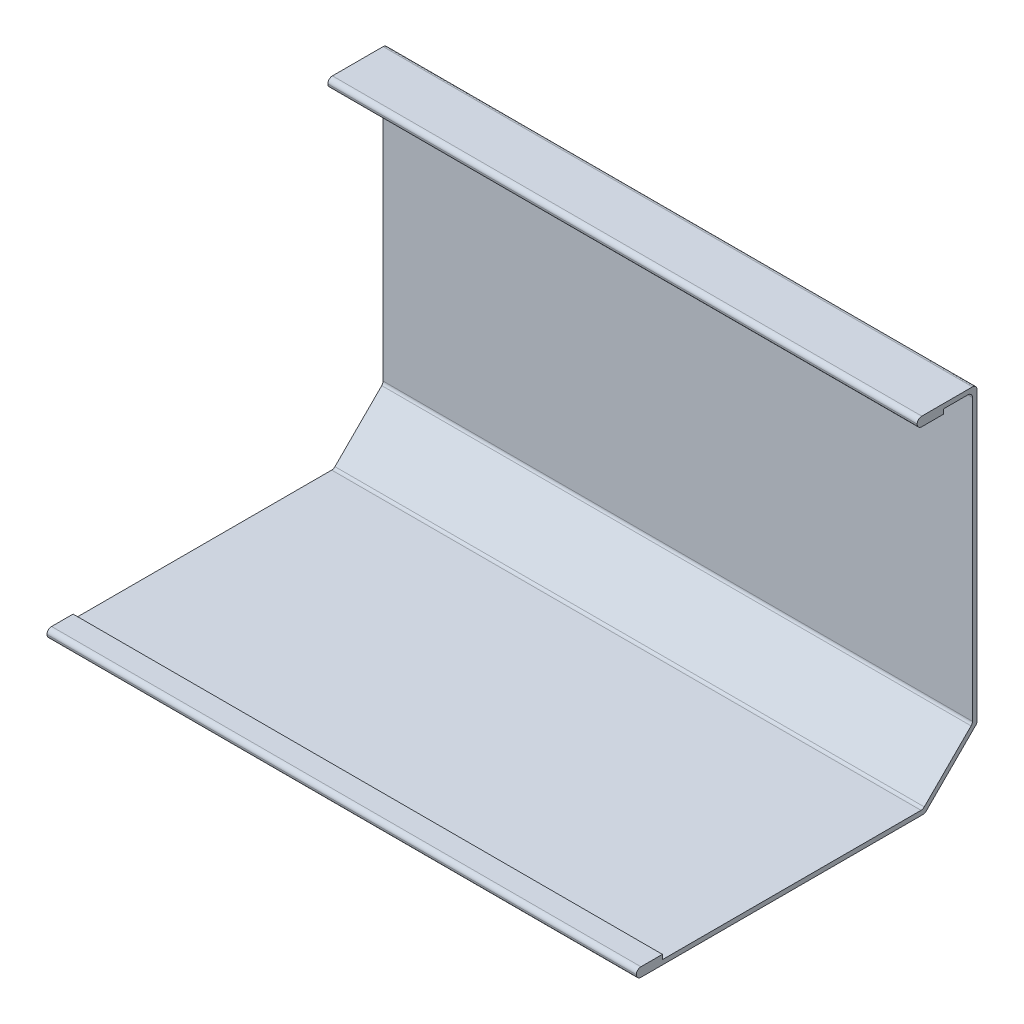
ISO-10303-21;
HEADER;
FILE_DESCRIPTION(('STEP AP214'),'2;1');
FILE_NAME('part.step','',(''),(''),'','','');
FILE_SCHEMA(('AUTOMOTIVE_DESIGN { 1 0 10303 214 1 1 1 1 }'));
ENDSEC;
DATA;
#1=APPLICATION_CONTEXT('core data for automotive mechanical design processes');
#2=APPLICATION_PROTOCOL_DEFINITION('international standard','automotive_design',2000,#1);
#3=PRODUCT_CONTEXT('',#1,'mechanical');
#4=PRODUCT('Part','Part','',(#3));
#5=PRODUCT_RELATED_PRODUCT_CATEGORY('part','',(#4));
#6=PRODUCT_DEFINITION_FORMATION('','',#4);
#7=PRODUCT_DEFINITION_CONTEXT('part definition',#1,'design');
#8=PRODUCT_DEFINITION('design','',#6,#7);
#9=PRODUCT_DEFINITION_SHAPE('','',#8);
#10=(LENGTH_UNIT() NAMED_UNIT(*) SI_UNIT(.MILLI.,.METRE.));
#11=(NAMED_UNIT(*) PLANE_ANGLE_UNIT() SI_UNIT($,.RADIAN.));
#12=(NAMED_UNIT(*) SI_UNIT($,.STERADIAN.) SOLID_ANGLE_UNIT());
#13=UNCERTAINTY_MEASURE_WITH_UNIT(LENGTH_MEASURE(1.E-05),#10,'distance_accuracy_value','');
#14=(GEOMETRIC_REPRESENTATION_CONTEXT(3) GLOBAL_UNCERTAINTY_ASSIGNED_CONTEXT((#13)) GLOBAL_UNIT_ASSIGNED_CONTEXT((#10,
#11,#12)) REPRESENTATION_CONTEXT('',''));
#15=CARTESIAN_POINT('',(0.,0.,0.));
#16=DIRECTION('',(0.,0.,1.));
#17=DIRECTION('',(1.,0.,0.));
#18=AXIS2_PLACEMENT_3D('',#15,#16,#17);
#19=CARTESIAN_POINT('',(-96.,9.56066017177982,9.56066017177978));
#20=DIRECTION('',(0.,0.707106781186549,0.707106781186546));
#21=DIRECTION('',(0.,-0.707106781186546,0.707106781186549));
#22=AXIS2_PLACEMENT_3D('',#19,#20,#21);
#23=PLANE('',#22);
#24=DIRECTION('',(0.,-0.707106781186546,0.707106781186549));
#25=VECTOR('',#24,1.);
#26=CARTESIAN_POINT('',(-96.,9.56066017177982,9.56066017177978));
#27=LINE('',#26,#25);
#28=CARTESIAN_POINT('',(-96.,17.1819805153393,1.93933982822023));
#29=VERTEX_POINT('',#28);
#30=CARTESIAN_POINT('',(-96.,1.93933982822018,17.1819805153395));
#31=VERTEX_POINT('',#30);
#32=EDGE_CURVE('E234',#29,#31,#27,.T.);
#33=ORIENTED_EDGE('',*,*,#32,.T.);
#34=DIRECTION('',(1.,0.,0.));
#35=VECTOR('',#34,1.);
#36=CARTESIAN_POINT('',(96.,1.93933982822018,17.1819805153395));
#37=LINE('',#36,#35);
#38=CARTESIAN_POINT('',(96.,1.93933982822018,17.1819805153395));
#39=VERTEX_POINT('',#38);
#40=EDGE_CURVE('E307',#31,#39,#37,.T.);
#41=ORIENTED_EDGE('',*,*,#40,.T.);
#42=DIRECTION('',(0.,-0.707106781186546,0.707106781186549));
#43=VECTOR('',#42,1.);
#44=CARTESIAN_POINT('',(96.,9.56066017177982,9.56066017177978));
#45=LINE('',#44,#43);
#46=CARTESIAN_POINT('',(96.,17.1819805153393,1.93933982822023));
#47=VERTEX_POINT('',#46);
#48=EDGE_CURVE('E193',#47,#39,#45,.T.);
#49=ORIENTED_EDGE('',*,*,#48,.F.);
#50=DIRECTION('',(1.,0.,0.));
#51=VECTOR('',#50,1.);
#52=CARTESIAN_POINT('',(-96.,17.1819805153393,1.93933982822023));
#53=LINE('',#52,#51);
#54=EDGE_CURVE('E305',#47,#29,#53,.F.);
#55=ORIENTED_EDGE('',*,*,#54,.T.);
#56=EDGE_LOOP('',(#33,#41,#49,#55));
#57=FACE_BOUND('',#56,.T.);
#58=ADVANCED_FACE('F33',(#57),#23,.T.);
#59=CARTESIAN_POINT('',(-96.,0.,1.50000000000007));
#60=DIRECTION('',(0.,0.,-1.));
#61=DIRECTION('',(0.,1.,0.));
#62=AXIS2_PLACEMENT_3D('',#59,#60,#61);
#63=PLANE('',#62);
#64=DIRECTION('',(0.,1.,0.));
#65=VECTOR('',#64,1.);
#66=CARTESIAN_POINT('',(-96.,0.,1.50000000000007));
#67=LINE('',#66,#65);
#68=CARTESIAN_POINT('',(-96.,18.2426406871192,1.50000000000005));
#69=VERTEX_POINT('',#68);
#70=CARTESIAN_POINT('',(-96.,109.6,1.5));
#71=VERTEX_POINT('',#70);
#72=EDGE_CURVE('E203',#69,#71,#67,.T.);
#73=ORIENTED_EDGE('',*,*,#72,.F.);
#74=DIRECTION('',(1.,0.,0.));
#75=VECTOR('',#74,1.);
#76=CARTESIAN_POINT('',(-96.,18.2426406871192,1.50000000000005));
#77=LINE('',#76,#75);
#78=CARTESIAN_POINT('',(96.,18.2426406871192,1.50000000000005));
#79=VERTEX_POINT('',#78);
#80=EDGE_CURVE('E323',#69,#79,#77,.T.);
#81=ORIENTED_EDGE('',*,*,#80,.T.);
#82=DIRECTION('',(0.,1.,0.));
#83=VECTOR('',#82,1.);
#84=CARTESIAN_POINT('',(96.,0.,1.50000000000007));
#85=LINE('',#84,#83);
#86=CARTESIAN_POINT('',(96.,109.6,1.5));
#87=VERTEX_POINT('',#86);
#88=EDGE_CURVE('E231',#79,#87,#85,.T.);
#89=ORIENTED_EDGE('',*,*,#88,.T.);
#90=DIRECTION('',(1.,0.,0.));
#91=VECTOR('',#90,1.);
#92=CARTESIAN_POINT('',(-96.,109.6,1.5));
#93=LINE('',#92,#91);
#94=EDGE_CURVE('E321',#87,#71,#93,.F.);
#95=ORIENTED_EDGE('',*,*,#94,.T.);
#96=EDGE_LOOP('',(#73,#81,#89,#95));
#97=FACE_BOUND('',#96,.T.);
#98=ADVANCED_FACE('F419',(#97),#63,.F.);
#99=CARTESIAN_POINT('',(-96.,111.1,0.));
#100=DIRECTION('',(0.,-1.,0.));
#101=DIRECTION('',(0.,0.,-1.));
#102=AXIS2_PLACEMENT_3D('',#99,#100,#101);
#103=PLANE('',#102);
#104=DIRECTION('',(0.,0.,-1.));
#105=VECTOR('',#104,1.);
#106=CARTESIAN_POINT('',(-96.,111.1,0.));
#107=LINE('',#106,#105);
#108=CARTESIAN_POINT('',(-96.,111.1,11.));
#109=VERTEX_POINT('',#108);
#110=CARTESIAN_POINT('',(-96.,111.1,3.));
#111=VERTEX_POINT('',#110);
#112=EDGE_CURVE('E259',#109,#111,#107,.T.);
#113=ORIENTED_EDGE('',*,*,#112,.T.);
#114=DIRECTION('',(1.,0.,0.));
#115=VECTOR('',#114,1.);
#116=CARTESIAN_POINT('',(-96.,111.1,3.));
#117=LINE('',#116,#115);
#118=CARTESIAN_POINT('',(96.,111.1,3.));
#119=VERTEX_POINT('',#118);
#120=EDGE_CURVE('E326',#111,#119,#117,.T.);
#121=ORIENTED_EDGE('',*,*,#120,.T.);
#122=DIRECTION('',(0.,0.,-1.));
#123=VECTOR('',#122,1.);
#124=CARTESIAN_POINT('',(96.,111.1,0.));
#125=LINE('',#124,#123);
#126=CARTESIAN_POINT('',(96.,111.1,11.));
#127=VERTEX_POINT('',#126);
#128=EDGE_CURVE('E228',#127,#119,#125,.T.);
#129=ORIENTED_EDGE('',*,*,#128,.F.);
#130=DIRECTION('',(1.,0.,0.));
#131=VECTOR('',#130,1.);
#132=CARTESIAN_POINT('',(-96.,111.1,11.));
#133=LINE('',#132,#131);
#134=EDGE_CURVE('E264',#109,#127,#133,.T.);
#135=ORIENTED_EDGE('',*,*,#134,.F.);
#136=EDGE_LOOP('',(#113,#121,#129,#135));
#137=FACE_BOUND('',#136,.T.);
#138=ADVANCED_FACE('F409',(#137),#103,.T.);
#139=CARTESIAN_POINT('',(-96.,0.,11.));
#140=DIRECTION('',(0.,0.,-1.));
#141=DIRECTION('',(-1.,0.,0.));
#142=AXIS2_PLACEMENT_3D('',#139,#140,#141);
#143=PLANE('',#142);
#144=ORIENTED_EDGE('',*,*,#134,.T.);
#145=DIRECTION('',(0.,1.,0.));
#146=VECTOR('',#145,1.);
#147=CARTESIAN_POINT('',(96.,0.,11.));
#148=LINE('',#147,#146);
#149=CARTESIAN_POINT('',(96.,109.6,11.));
#150=VERTEX_POINT('',#149);
#151=EDGE_CURVE('E225',#150,#127,#148,.T.);
#152=ORIENTED_EDGE('',*,*,#151,.F.);
#153=DIRECTION('',(1.,0.,0.));
#154=VECTOR('',#153,1.);
#155=CARTESIAN_POINT('',(-96.,109.6,11.));
#156=LINE('',#155,#154);
#157=CARTESIAN_POINT('',(-96.,109.6,11.));
#158=VERTEX_POINT('',#157);
#159=EDGE_CURVE('E267',#158,#150,#156,.T.);
#160=ORIENTED_EDGE('',*,*,#159,.F.);
#161=DIRECTION('',(0.,1.,0.));
#162=VECTOR('',#161,1.);
#163=CARTESIAN_POINT('',(-96.,0.,11.));
#164=LINE('',#163,#162);
#165=EDGE_CURVE('E256',#158,#109,#164,.T.);
#166=ORIENTED_EDGE('',*,*,#165,.T.);
#167=EDGE_LOOP('',(#144,#152,#160,#166));
#168=FACE_BOUND('',#167,.T.);
#169=ADVANCED_FACE('F406',(#168),#143,.T.);
#170=CARTESIAN_POINT('',(-96.,109.6,0.));
#171=DIRECTION('',(0.,-1.,0.));
#172=DIRECTION('',(0.,0.,-1.));
#173=AXIS2_PLACEMENT_3D('',#170,#171,#172);
#174=PLANE('',#173);
#175=DIRECTION('',(0.,0.,-1.));
#176=VECTOR('',#175,1.);
#177=CARTESIAN_POINT('',(96.,109.6,0.));
#178=LINE('',#177,#176);
#179=CARTESIAN_POINT('',(96.,109.6,18.));
#180=VERTEX_POINT('',#179);
#181=EDGE_CURVE('E223',#180,#150,#178,.T.);
#182=ORIENTED_EDGE('',*,*,#181,.F.);
#183=DIRECTION('',(1.,0.,0.));
#184=VECTOR('',#183,1.);
#185=CARTESIAN_POINT('',(-96.,109.6,18.));
#186=LINE('',#185,#184);
#187=CARTESIAN_POINT('',(-96.,109.6,18.));
#188=VERTEX_POINT('',#187);
#189=EDGE_CURVE('E333',#180,#188,#186,.F.);
#190=ORIENTED_EDGE('',*,*,#189,.T.);
#191=DIRECTION('',(0.,0.,-1.));
#192=VECTOR('',#191,1.);
#193=CARTESIAN_POINT('',(-96.,109.6,0.));
#194=LINE('',#193,#192);
#195=EDGE_CURVE('E254',#188,#158,#194,.T.);
#196=ORIENTED_EDGE('',*,*,#195,.T.);
#197=ORIENTED_EDGE('',*,*,#159,.T.);
#198=EDGE_LOOP('',(#182,#190,#196,#197));
#199=FACE_BOUND('',#198,.T.);
#200=ADVANCED_FACE('F401',(#199),#174,.T.);
#201=CARTESIAN_POINT('',(-96.,112.6,0.));
#202=DIRECTION('',(0.,1.,0.));
#203=DIRECTION('',(0.,0.,1.));
#204=AXIS2_PLACEMENT_3D('',#201,#202,#203);
#205=PLANE('',#204);
#206=DIRECTION('',(0.,0.,1.));
#207=VECTOR('',#206,1.);
#208=CARTESIAN_POINT('',(96.,112.6,0.));
#209=LINE('',#208,#207);
#210=CARTESIAN_POINT('',(96.,112.6,1.5));
#211=VERTEX_POINT('',#210);
#212=CARTESIAN_POINT('',(96.,112.6,18.));
#213=VERTEX_POINT('',#212);
#214=EDGE_CURVE('E220',#211,#213,#209,.T.);
#215=ORIENTED_EDGE('',*,*,#214,.F.);
#216=DIRECTION('',(1.,0.,0.));
#217=VECTOR('',#216,1.);
#218=CARTESIAN_POINT('',(-96.,112.6,1.5));
#219=LINE('',#218,#217);
#220=CARTESIAN_POINT('',(-96.,112.6,1.5));
#221=VERTEX_POINT('',#220);
#222=EDGE_CURVE('E331',#211,#221,#219,.F.);
#223=ORIENTED_EDGE('',*,*,#222,.T.);
#224=DIRECTION('',(0.,0.,1.));
#225=VECTOR('',#224,1.);
#226=CARTESIAN_POINT('',(-96.,112.6,0.));
#227=LINE('',#226,#225);
#228=CARTESIAN_POINT('',(-96.,112.6,18.));
#229=VERTEX_POINT('',#228);
#230=EDGE_CURVE('E251',#221,#229,#227,.T.);
#231=ORIENTED_EDGE('',*,*,#230,.T.);
#232=DIRECTION('',(1.,0.,0.));
#233=VECTOR('',#232,1.);
#234=CARTESIAN_POINT('',(-96.,112.6,18.));
#235=LINE('',#234,#233);
#236=EDGE_CURVE('E329',#229,#213,#235,.T.);
#237=ORIENTED_EDGE('',*,*,#236,.T.);
#238=EDGE_LOOP('',(#215,#223,#231,#237));
#239=FACE_BOUND('',#238,.T.);
#240=ADVANCED_FACE('F365',(#239),#205,.T.);
#241=CARTESIAN_POINT('',(-96.,0.,0.));
#242=DIRECTION('',(0.,0.,-1.));
#243=DIRECTION('',(-1.,0.,0.));
#244=AXIS2_PLACEMENT_3D('',#241,#242,#243);
#245=PLANE('',#244);
#246=DIRECTION('',(0.,1.,0.));
#247=VECTOR('',#246,1.);
#248=CARTESIAN_POINT('',(96.,0.,0.));
#249=LINE('',#248,#247);
#250=CARTESIAN_POINT('',(96.,17.6213203435596,0.));
#251=VERTEX_POINT('',#250);
#252=CARTESIAN_POINT('',(96.,111.1,0.));
#253=VERTEX_POINT('',#252);
#254=EDGE_CURVE('E217',#251,#253,#249,.T.);
#255=ORIENTED_EDGE('',*,*,#254,.F.);
#256=DIRECTION('',(1.,0.,0.));
#257=VECTOR('',#256,1.);
#258=CARTESIAN_POINT('',(-96.,17.6213203435596,0.));
#259=LINE('',#258,#257);
#260=CARTESIAN_POINT('',(-96.,17.6213203435596,0.));
#261=VERTEX_POINT('',#260);
#262=EDGE_CURVE('E319',#251,#261,#259,.F.);
#263=ORIENTED_EDGE('',*,*,#262,.T.);
#264=DIRECTION('',(0.,1.,0.));
#265=VECTOR('',#264,1.);
#266=CARTESIAN_POINT('',(-96.,0.,0.));
#267=LINE('',#266,#265);
#268=CARTESIAN_POINT('',(-96.,111.1,0.));
#269=VERTEX_POINT('',#268);
#270=EDGE_CURVE('E248',#261,#269,#267,.T.);
#271=ORIENTED_EDGE('',*,*,#270,.T.);
#272=DIRECTION('',(1.,0.,0.));
#273=VECTOR('',#272,1.);
#274=CARTESIAN_POINT('',(-96.,111.1,0.));
#275=LINE('',#274,#273);
#276=EDGE_CURVE('E316',#269,#253,#275,.T.);
#277=ORIENTED_EDGE('',*,*,#276,.T.);
#278=EDGE_LOOP('',(#255,#263,#271,#277));
#279=FACE_BOUND('',#278,.T.);
#280=ADVANCED_FACE('F374',(#279),#245,.T.);
#281=CARTESIAN_POINT('',(-96.,8.5,8.5));
#282=DIRECTION('',(0.,-0.707106781186547,-0.707106781186547));
#283=DIRECTION('',(0.,0.707106781186548,-0.707106781186548));
#284=AXIS2_PLACEMENT_3D('',#281,#282,#283);
#285=PLANE('',#284);
#286=DIRECTION('',(0.,0.707106781186548,-0.707106781186548));
#287=VECTOR('',#286,1.);
#288=CARTESIAN_POINT('',(-96.,8.5,8.5));
#289=LINE('',#288,#287);
#290=CARTESIAN_POINT('',(-96.,0.439339828220179,16.5606601717798));
#291=VERTEX_POINT('',#290);
#292=CARTESIAN_POINT('',(-96.,16.5606601717798,0.439339828220179));
#293=VERTEX_POINT('',#292);
#294=EDGE_CURVE('E245',#291,#293,#289,.T.);
#295=ORIENTED_EDGE('',*,*,#294,.T.);
#296=DIRECTION('',(1.,0.,0.));
#297=VECTOR('',#296,1.);
#298=CARTESIAN_POINT('',(-96.,16.5606601717798,0.43933982822018));
#299=LINE('',#298,#297);
#300=CARTESIAN_POINT('',(96.,16.5606601717798,0.439339828220179));
#301=VERTEX_POINT('',#300);
#302=EDGE_CURVE('E313',#293,#301,#299,.T.);
#303=ORIENTED_EDGE('',*,*,#302,.T.);
#304=DIRECTION('',(0.,0.707106781186548,-0.707106781186548));
#305=VECTOR('',#304,1.);
#306=CARTESIAN_POINT('',(96.,8.5,8.5));
#307=LINE('',#306,#305);
#308=CARTESIAN_POINT('',(96.,0.439339828220179,16.5606601717798));
#309=VERTEX_POINT('',#308);
#310=EDGE_CURVE('E214',#309,#301,#307,.T.);
#311=ORIENTED_EDGE('',*,*,#310,.F.);
#312=DIRECTION('',(1.,0.,0.));
#313=VECTOR('',#312,1.);
#314=CARTESIAN_POINT('',(-96.,0.43933982822018,16.5606601717798));
#315=LINE('',#314,#313);
#316=EDGE_CURVE('E311',#309,#291,#315,.F.);
#317=ORIENTED_EDGE('',*,*,#316,.T.);
#318=EDGE_LOOP('',(#295,#303,#311,#317));
#319=FACE_BOUND('',#318,.T.);
#320=ADVANCED_FACE('F382',(#319),#285,.T.);
#321=CARTESIAN_POINT('',(-96.,0.,0.));
#322=DIRECTION('',(0.,-1.,0.));
#323=DIRECTION('',(0.,0.,-1.));
#324=AXIS2_PLACEMENT_3D('',#321,#322,#323);
#325=PLANE('',#324);
#326=DIRECTION('',(0.,0.,-1.));
#327=VECTOR('',#326,1.);
#328=CARTESIAN_POINT('',(96.,0.,0.));
#329=LINE('',#328,#327);
#330=CARTESIAN_POINT('',(96.,0.,109.5));
#331=VERTEX_POINT('',#330);
#332=CARTESIAN_POINT('',(96.,0.,17.6213203435596));
#333=VERTEX_POINT('',#332);
#334=EDGE_CURVE('E208',#331,#333,#329,.T.);
#335=ORIENTED_EDGE('',*,*,#334,.F.);
#336=DIRECTION('',(1.,0.,0.));
#337=VECTOR('',#336,1.);
#338=CARTESIAN_POINT('',(-96.,0.,109.5));
#339=LINE('',#338,#337);
#340=CARTESIAN_POINT('',(-96.,0.,109.5));
#341=VERTEX_POINT('',#340);
#342=EDGE_CURVE('E287',#331,#341,#339,.F.);
#343=ORIENTED_EDGE('',*,*,#342,.T.);
#344=DIRECTION('',(0.,0.,-1.));
#345=VECTOR('',#344,1.);
#346=CARTESIAN_POINT('',(-96.,0.,0.));
#347=LINE('',#346,#345);
#348=CARTESIAN_POINT('',(-96.,0.,17.6213203435596));
#349=VERTEX_POINT('',#348);
#350=EDGE_CURVE('E242',#341,#349,#347,.T.);
#351=ORIENTED_EDGE('',*,*,#350,.T.);
#352=DIRECTION('',(1.,0.,0.));
#353=VECTOR('',#352,1.);
#354=CARTESIAN_POINT('',(-96.,0.,17.6213203435596));
#355=LINE('',#354,#353);
#356=EDGE_CURVE('E284',#349,#333,#355,.T.);
#357=ORIENTED_EDGE('',*,*,#356,.T.);
#358=EDGE_LOOP('',(#335,#343,#351,#357));
#359=FACE_BOUND('',#358,.T.);
#360=ADVANCED_FACE('F390',(#359),#325,.T.);
#361=CARTESIAN_POINT('',(-96.,3.,0.));
#362=DIRECTION('',(0.,1.,0.));
#363=DIRECTION('',(0.,0.,1.));
#364=AXIS2_PLACEMENT_3D('',#361,#362,#363);
#365=PLANE('',#364);
#366=DIRECTION('',(0.,0.,1.));
#367=VECTOR('',#366,1.);
#368=CARTESIAN_POINT('',(-96.,3.,0.));
#369=LINE('',#368,#367);
#370=CARTESIAN_POINT('',(-96.,3.,102.5));
#371=VERTEX_POINT('',#370);
#372=CARTESIAN_POINT('',(-96.,3.,109.5));
#373=VERTEX_POINT('',#372);
#374=EDGE_CURVE('E240',#371,#373,#369,.T.);
#375=ORIENTED_EDGE('',*,*,#374,.T.);
#376=DIRECTION('',(1.,0.,0.));
#377=VECTOR('',#376,1.);
#378=CARTESIAN_POINT('',(-96.,3.,109.5));
#379=LINE('',#378,#377);
#380=CARTESIAN_POINT('',(96.,3.,109.5));
#381=VERTEX_POINT('',#380);
#382=EDGE_CURVE('E303',#373,#381,#379,.T.);
#383=ORIENTED_EDGE('',*,*,#382,.T.);
#384=DIRECTION('',(0.,0.,1.));
#385=VECTOR('',#384,1.);
#386=CARTESIAN_POINT('',(96.,3.,0.));
#387=LINE('',#386,#385);
#388=CARTESIAN_POINT('',(96.,3.,102.5));
#389=VERTEX_POINT('',#388);
#390=EDGE_CURVE('E206',#389,#381,#387,.T.);
#391=ORIENTED_EDGE('',*,*,#390,.F.);
#392=DIRECTION('',(1.,0.,0.));
#393=VECTOR('',#392,1.);
#394=CARTESIAN_POINT('',(-96.,3.,102.5));
#395=LINE('',#394,#393);
#396=EDGE_CURVE('E202',#371,#389,#395,.T.);
#397=ORIENTED_EDGE('',*,*,#396,.F.);
#398=EDGE_LOOP('',(#375,#383,#391,#397));
#399=FACE_BOUND('',#398,.T.);
#400=ADVANCED_FACE('F398',(#399),#365,.T.);
#401=CARTESIAN_POINT('',(-96.,0.,102.5));
#402=DIRECTION('',(0.,0.,-1.));
#403=DIRECTION('',(-1.,0.,0.));
#404=AXIS2_PLACEMENT_3D('',#401,#402,#403);
#405=PLANE('',#404);
#406=ORIENTED_EDGE('',*,*,#396,.T.);
#407=DIRECTION('',(0.,1.,0.));
#408=VECTOR('',#407,1.);
#409=CARTESIAN_POINT('',(96.,0.,102.5));
#410=LINE('',#409,#408);
#411=CARTESIAN_POINT('',(96.,1.50000000000001,102.5));
#412=VERTEX_POINT('',#411);
#413=EDGE_CURVE('E189',#412,#389,#410,.T.);
#414=ORIENTED_EDGE('',*,*,#413,.F.);
#415=DIRECTION('',(1.,0.,0.));
#416=VECTOR('',#415,1.);
#417=CARTESIAN_POINT('',(-96.,1.50000000000001,102.5));
#418=LINE('',#417,#416);
#419=CARTESIAN_POINT('',(-96.,1.50000000000001,102.5));
#420=VERTEX_POINT('',#419);
#421=EDGE_CURVE('E196',#420,#412,#418,.T.);
#422=ORIENTED_EDGE('',*,*,#421,.F.);
#423=DIRECTION('',(0.,1.,0.));
#424=VECTOR('',#423,1.);
#425=CARTESIAN_POINT('',(-96.,0.,102.5));
#426=LINE('',#425,#424);
#427=EDGE_CURVE('E238',#420,#371,#426,.T.);
#428=ORIENTED_EDGE('',*,*,#427,.T.);
#429=EDGE_LOOP('',(#406,#414,#422,#428));
#430=FACE_BOUND('',#429,.T.);
#431=ADVANCED_FACE('F205',(#430),#405,.T.);
#432=CARTESIAN_POINT('',(-96.,1.5,0.));
#433=DIRECTION('',(0.,1.,0.));
#434=DIRECTION('',(0.,0.,1.));
#435=AXIS2_PLACEMENT_3D('',#432,#433,#434);
#436=PLANE('',#435);
#437=DIRECTION('',(0.,0.,1.));
#438=VECTOR('',#437,1.);
#439=CARTESIAN_POINT('',(96.,1.5,0.));
#440=LINE('',#439,#438);
#441=CARTESIAN_POINT('',(96.,1.5,18.2426406871193));
#442=VERTEX_POINT('',#441);
#443=EDGE_CURVE('E184',#442,#412,#440,.T.);
#444=ORIENTED_EDGE('',*,*,#443,.F.);
#445=DIRECTION('',(1.,0.,0.));
#446=VECTOR('',#445,1.);
#447=CARTESIAN_POINT('',(-96.,1.5,18.2426406871193));
#448=LINE('',#447,#446);
#449=CARTESIAN_POINT('',(-96.,1.5,18.2426406871193));
#450=VERTEX_POINT('',#449);
#451=EDGE_CURVE('E50',#442,#450,#448,.F.);
#452=ORIENTED_EDGE('',*,*,#451,.T.);
#453=DIRECTION('',(0.,0.,1.));
#454=VECTOR('',#453,1.);
#455=CARTESIAN_POINT('',(-96.,1.5,0.));
#456=LINE('',#455,#454);
#457=EDGE_CURVE('E198',#450,#420,#456,.T.);
#458=ORIENTED_EDGE('',*,*,#457,.T.);
#459=ORIENTED_EDGE('',*,*,#421,.T.);
#460=EDGE_LOOP('',(#444,#452,#458,#459));
#461=FACE_BOUND('',#460,.T.);
#462=ADVANCED_FACE('F197',(#461),#436,.T.);
#463=CARTESIAN_POINT('',(-96.,0.,0.));
#464=DIRECTION('',(1.,0.,0.));
#465=DIRECTION('',(0.,0.,-1.));
#466=AXIS2_PLACEMENT_3D('',#463,#464,#465);
#467=PLANE('',#466);
#468=ORIENTED_EDGE('',*,*,#350,.F.);
#469=CARTESIAN_POINT('',(-96.,1.5,109.5));
#470=DIRECTION('',(1.,0.,0.));
#471=DIRECTION('',(0.,0.,-1.));
#472=AXIS2_PLACEMENT_3D('',#469,#470,#471);
#473=CIRCLE('',#472,1.5);
#474=CARTESIAN_POINT('',(-96.,1.5,111.));
#475=VERTEX_POINT('',#474);
#476=EDGE_CURVE('E301',#341,#475,#473,.F.);
#477=ORIENTED_EDGE('',*,*,#476,.T.);
#478=CARTESIAN_POINT('',(-96.,1.5,109.5));
#479=DIRECTION('',(1.,0.,0.));
#480=DIRECTION('',(0.,0.,-1.));
#481=AXIS2_PLACEMENT_3D('',#478,#479,#480);
#482=CIRCLE('',#481,1.5);
#483=EDGE_CURVE('E58',#475,#373,#482,.F.);
#484=ORIENTED_EDGE('',*,*,#483,.T.);
#485=ORIENTED_EDGE('',*,*,#374,.F.);
#486=ORIENTED_EDGE('',*,*,#427,.F.);
#487=ORIENTED_EDGE('',*,*,#457,.F.);
#488=CARTESIAN_POINT('',(-96.,3.,18.2426406871193));
#489=DIRECTION('',(1.,0.,0.));
#490=DIRECTION('',(0.,0.,-1.));
#491=AXIS2_PLACEMENT_3D('',#488,#489,#490);
#492=CIRCLE('',#491,1.5);
#493=EDGE_CURVE('E337',#450,#31,#492,.T.);
#494=ORIENTED_EDGE('',*,*,#493,.T.);
#495=ORIENTED_EDGE('',*,*,#32,.F.);
#496=CARTESIAN_POINT('',(-96.,18.2426406871192,3.00000000000006));
#497=DIRECTION('',(1.,0.,0.));
#498=DIRECTION('',(0.,0.,-1.));
#499=AXIS2_PLACEMENT_3D('',#496,#497,#498);
#500=CIRCLE('',#499,1.5);
#501=EDGE_CURVE('E341',#29,#69,#500,.T.);
#502=ORIENTED_EDGE('',*,*,#501,.T.);
#503=ORIENTED_EDGE('',*,*,#72,.T.);
#504=CARTESIAN_POINT('',(-96.,109.6,3.));
#505=DIRECTION('',(1.,0.,0.));
#506=DIRECTION('',(0.,0.,-1.));
#507=AXIS2_PLACEMENT_3D('',#504,#505,#506);
#508=CIRCLE('',#507,1.5);
#509=EDGE_CURVE('E11',#71,#111,#508,.T.);
#510=ORIENTED_EDGE('',*,*,#509,.T.);
#511=ORIENTED_EDGE('',*,*,#112,.F.);
#512=ORIENTED_EDGE('',*,*,#165,.F.);
#513=ORIENTED_EDGE('',*,*,#195,.F.);
#514=CARTESIAN_POINT('',(-96.,111.1,18.));
#515=DIRECTION('',(1.,0.,0.));
#516=DIRECTION('',(0.,0.,-1.));
#517=AXIS2_PLACEMENT_3D('',#514,#515,#516);
#518=CIRCLE('',#517,1.5);
#519=CARTESIAN_POINT('',(-96.,111.1,19.5));
#520=VERTEX_POINT('',#519);
#521=EDGE_CURVE('E292',#188,#520,#518,.F.);
#522=ORIENTED_EDGE('',*,*,#521,.T.);
#523=CARTESIAN_POINT('',(-96.,111.1,18.));
#524=DIRECTION('',(1.,0.,0.));
#525=DIRECTION('',(0.,0.,-1.));
#526=AXIS2_PLACEMENT_3D('',#523,#524,#525);
#527=CIRCLE('',#526,1.5);
#528=EDGE_CURVE('E290',#520,#229,#527,.F.);
#529=ORIENTED_EDGE('',*,*,#528,.T.);
#530=ORIENTED_EDGE('',*,*,#230,.F.);
#531=CARTESIAN_POINT('',(-96.,111.1,1.5));
#532=DIRECTION('',(1.,0.,0.));
#533=DIRECTION('',(0.,0.,-1.));
#534=AXIS2_PLACEMENT_3D('',#531,#532,#533);
#535=CIRCLE('',#534,1.5);
#536=EDGE_CURVE('E294',#221,#269,#535,.F.);
#537=ORIENTED_EDGE('',*,*,#536,.T.);
#538=ORIENTED_EDGE('',*,*,#270,.F.);
#539=CARTESIAN_POINT('',(-96.,17.6213203435596,1.5));
#540=DIRECTION('',(1.,0.,0.));
#541=DIRECTION('',(0.,0.,-1.));
#542=AXIS2_PLACEMENT_3D('',#539,#540,#541);
#543=CIRCLE('',#542,1.5);
#544=EDGE_CURVE('E298',#261,#293,#543,.F.);
#545=ORIENTED_EDGE('',*,*,#544,.T.);
#546=ORIENTED_EDGE('',*,*,#294,.F.);
#547=CARTESIAN_POINT('',(-96.,1.5,17.6213203435596));
#548=DIRECTION('',(1.,0.,0.));
#549=DIRECTION('',(0.,0.,-1.));
#550=AXIS2_PLACEMENT_3D('',#547,#548,#549);
#551=CIRCLE('',#550,1.5);
#552=EDGE_CURVE('E296',#291,#349,#551,.F.);
#553=ORIENTED_EDGE('',*,*,#552,.T.);
#554=EDGE_LOOP('',(#468,#477,#484,#485,#486,#487,#494,#495,#502,#503,#510,#511,#512,#513,#522,
#529,#530,#537,#538,#545,#546,#553));
#555=FACE_BOUND('',#554,.T.);
#556=ADVANCED_FACE('F360',(#555),#467,.F.);
#557=CARTESIAN_POINT('',(96.,0.,0.));
#558=DIRECTION('',(1.,0.,0.));
#559=DIRECTION('',(0.,0.,-1.));
#560=AXIS2_PLACEMENT_3D('',#557,#558,#559);
#561=PLANE('',#560);
#562=CARTESIAN_POINT('',(96.,1.5,109.5));
#563=DIRECTION('',(1.,0.,0.));
#564=DIRECTION('',(0.,0.,-1.));
#565=AXIS2_PLACEMENT_3D('',#562,#563,#564);
#566=CIRCLE('',#565,1.5);
#567=CARTESIAN_POINT('',(96.,1.5,111.));
#568=VERTEX_POINT('',#567);
#569=EDGE_CURVE('E280',#381,#568,#566,.T.);
#570=ORIENTED_EDGE('',*,*,#569,.T.);
#571=CARTESIAN_POINT('',(96.,1.5,109.5));
#572=DIRECTION('',(1.,0.,0.));
#573=DIRECTION('',(0.,0.,-1.));
#574=AXIS2_PLACEMENT_3D('',#571,#572,#573);
#575=CIRCLE('',#574,1.5);
#576=EDGE_CURVE('E282',#568,#331,#575,.T.);
#577=ORIENTED_EDGE('',*,*,#576,.T.);
#578=ORIENTED_EDGE('',*,*,#334,.T.);
#579=CARTESIAN_POINT('',(96.,1.5,17.6213203435596));
#580=DIRECTION('',(1.,0.,0.));
#581=DIRECTION('',(0.,0.,-1.));
#582=AXIS2_PLACEMENT_3D('',#579,#580,#581);
#583=CIRCLE('',#582,1.5);
#584=EDGE_CURVE('E276',#333,#309,#583,.T.);
#585=ORIENTED_EDGE('',*,*,#584,.T.);
#586=ORIENTED_EDGE('',*,*,#310,.T.);
#587=CARTESIAN_POINT('',(96.,17.6213203435596,1.5));
#588=DIRECTION('',(1.,0.,0.));
#589=DIRECTION('',(0.,0.,-1.));
#590=AXIS2_PLACEMENT_3D('',#587,#588,#589);
#591=CIRCLE('',#590,1.5);
#592=EDGE_CURVE('E278',#301,#251,#591,.T.);
#593=ORIENTED_EDGE('',*,*,#592,.T.);
#594=ORIENTED_EDGE('',*,*,#254,.T.);
#595=CARTESIAN_POINT('',(96.,111.1,1.5));
#596=DIRECTION('',(1.,0.,0.));
#597=DIRECTION('',(0.,0.,-1.));
#598=AXIS2_PLACEMENT_3D('',#595,#596,#597);
#599=CIRCLE('',#598,1.5);
#600=EDGE_CURVE('E274',#253,#211,#599,.T.);
#601=ORIENTED_EDGE('',*,*,#600,.T.);
#602=ORIENTED_EDGE('',*,*,#214,.T.);
#603=CARTESIAN_POINT('',(96.,111.1,18.));
#604=DIRECTION('',(1.,0.,0.));
#605=DIRECTION('',(0.,0.,-1.));
#606=AXIS2_PLACEMENT_3D('',#603,#604,#605);
#607=CIRCLE('',#606,1.5);
#608=CARTESIAN_POINT('',(96.,111.1,19.5));
#609=VERTEX_POINT('',#608);
#610=EDGE_CURVE('E266',#213,#609,#607,.T.);
#611=ORIENTED_EDGE('',*,*,#610,.T.);
#612=CARTESIAN_POINT('',(96.,111.1,18.));
#613=DIRECTION('',(1.,0.,0.));
#614=DIRECTION('',(0.,0.,-1.));
#615=AXIS2_PLACEMENT_3D('',#612,#613,#614);
#616=CIRCLE('',#615,1.5);
#617=EDGE_CURVE('E272',#609,#180,#616,.T.);
#618=ORIENTED_EDGE('',*,*,#617,.T.);
#619=ORIENTED_EDGE('',*,*,#181,.T.);
#620=ORIENTED_EDGE('',*,*,#151,.T.);
#621=ORIENTED_EDGE('',*,*,#128,.T.);
#622=CARTESIAN_POINT('',(96.,109.6,3.));
#623=DIRECTION('',(1.,0.,0.));
#624=DIRECTION('',(0.,0.,-1.));
#625=AXIS2_PLACEMENT_3D('',#622,#623,#624);
#626=CIRCLE('',#625,1.5);
#627=EDGE_CURVE('E42',#119,#87,#626,.F.);
#628=ORIENTED_EDGE('',*,*,#627,.T.);
#629=ORIENTED_EDGE('',*,*,#88,.F.);
#630=CARTESIAN_POINT('',(96.,18.2426406871192,3.00000000000006));
#631=DIRECTION('',(1.,0.,0.));
#632=DIRECTION('',(0.,0.,-1.));
#633=AXIS2_PLACEMENT_3D('',#630,#631,#632);
#634=CIRCLE('',#633,1.5);
#635=EDGE_CURVE('E339',#79,#47,#634,.F.);
#636=ORIENTED_EDGE('',*,*,#635,.T.);
#637=ORIENTED_EDGE('',*,*,#48,.T.);
#638=CARTESIAN_POINT('',(96.,3.,18.2426406871193));
#639=DIRECTION('',(1.,0.,0.));
#640=DIRECTION('',(0.,0.,-1.));
#641=AXIS2_PLACEMENT_3D('',#638,#639,#640);
#642=CIRCLE('',#641,1.5);
#643=EDGE_CURVE('E192',#39,#442,#642,.F.);
#644=ORIENTED_EDGE('',*,*,#643,.T.);
#645=ORIENTED_EDGE('',*,*,#443,.T.);
#646=ORIENTED_EDGE('',*,*,#413,.T.);
#647=ORIENTED_EDGE('',*,*,#390,.T.);
#648=EDGE_LOOP('',(#570,#577,#578,#585,#586,#593,#594,#601,#602,#611,#618,#619,#620,#621,#628,
#629,#636,#637,#644,#645,#646,#647));
#649=FACE_BOUND('',#648,.T.);
#650=ADVANCED_FACE('F186',(#649),#561,.T.);
#651=CARTESIAN_POINT('',(-96.,1.5,109.5));
#652=DIRECTION('',(1.,0.,0.));
#653=DIRECTION('',(0.,0.,-1.));
#654=AXIS2_PLACEMENT_3D('',#651,#652,#653);
#655=CYLINDRICAL_SURFACE('',#654,1.5);
#656=ORIENTED_EDGE('',*,*,#382,.F.);
#657=ORIENTED_EDGE('',*,*,#483,.F.);
#658=DIRECTION('',(1.,0.,0.));
#659=VECTOR('',#658,1.);
#660=CARTESIAN_POINT('',(-96.,1.5,111.));
#661=LINE('',#660,#659);
#662=EDGE_CURVE('E343',#568,#475,#661,.F.);
#663=ORIENTED_EDGE('',*,*,#662,.F.);
#664=ORIENTED_EDGE('',*,*,#569,.F.);
#665=EDGE_LOOP('',(#656,#657,#663,#664));
#666=FACE_BOUND('',#665,.T.);
#667=ADVANCED_FACE('F395',(#666),#655,.T.);
#668=CARTESIAN_POINT('',(-96.,1.5,109.5));
#669=DIRECTION('',(1.,0.,0.));
#670=DIRECTION('',(0.,0.,-1.));
#671=AXIS2_PLACEMENT_3D('',#668,#669,#670);
#672=CYLINDRICAL_SURFACE('',#671,1.5);
#673=ORIENTED_EDGE('',*,*,#476,.F.);
#674=ORIENTED_EDGE('',*,*,#342,.F.);
#675=ORIENTED_EDGE('',*,*,#576,.F.);
#676=ORIENTED_EDGE('',*,*,#662,.T.);
#677=EDGE_LOOP('',(#673,#674,#675,#676));
#678=FACE_BOUND('',#677,.T.);
#679=ADVANCED_FACE('F392',(#678),#672,.T.);
#680=CARTESIAN_POINT('',(-96.,3.,18.2426406871193));
#681=DIRECTION('',(-1.,0.,0.));
#682=DIRECTION('',(0.,0.,1.));
#683=AXIS2_PLACEMENT_3D('',#680,#681,#682);
#684=CYLINDRICAL_SURFACE('',#683,1.5);
#685=ORIENTED_EDGE('',*,*,#493,.F.);
#686=ORIENTED_EDGE('',*,*,#451,.F.);
#687=ORIENTED_EDGE('',*,*,#643,.F.);
#688=ORIENTED_EDGE('',*,*,#40,.F.);
#689=EDGE_LOOP('',(#685,#686,#687,#688));
#690=FACE_BOUND('',#689,.T.);
#691=ADVANCED_FACE('F431',(#690),#684,.F.);
#692=CARTESIAN_POINT('',(-96.,17.6213203435596,1.5));
#693=DIRECTION('',(1.,0.,0.));
#694=DIRECTION('',(0.,0.,-1.));
#695=AXIS2_PLACEMENT_3D('',#692,#693,#694);
#696=CYLINDRICAL_SURFACE('',#695,1.5);
#697=ORIENTED_EDGE('',*,*,#544,.F.);
#698=ORIENTED_EDGE('',*,*,#262,.F.);
#699=ORIENTED_EDGE('',*,*,#592,.F.);
#700=ORIENTED_EDGE('',*,*,#302,.F.);
#701=EDGE_LOOP('',(#697,#698,#699,#700));
#702=FACE_BOUND('',#701,.T.);
#703=ADVANCED_FACE('F377',(#702),#696,.T.);
#704=CARTESIAN_POINT('',(-96.,1.5,17.6213203435596));
#705=DIRECTION('',(1.,0.,0.));
#706=DIRECTION('',(0.,0.,-1.));
#707=AXIS2_PLACEMENT_3D('',#704,#705,#706);
#708=CYLINDRICAL_SURFACE('',#707,1.5);
#709=ORIENTED_EDGE('',*,*,#552,.F.);
#710=ORIENTED_EDGE('',*,*,#316,.F.);
#711=ORIENTED_EDGE('',*,*,#584,.F.);
#712=ORIENTED_EDGE('',*,*,#356,.F.);
#713=EDGE_LOOP('',(#709,#710,#711,#712));
#714=FACE_BOUND('',#713,.T.);
#715=ADVANCED_FACE('F386',(#714),#708,.T.);
#716=CARTESIAN_POINT('',(-96.,18.2426406871192,3.00000000000006));
#717=DIRECTION('',(1.,0.,0.));
#718=DIRECTION('',(0.,0.,-1.));
#719=AXIS2_PLACEMENT_3D('',#716,#717,#718);
#720=CYLINDRICAL_SURFACE('',#719,1.5);
#721=ORIENTED_EDGE('',*,*,#501,.F.);
#722=ORIENTED_EDGE('',*,*,#54,.F.);
#723=ORIENTED_EDGE('',*,*,#635,.F.);
#724=ORIENTED_EDGE('',*,*,#80,.F.);
#725=EDGE_LOOP('',(#721,#722,#723,#724));
#726=FACE_BOUND('',#725,.T.);
#727=ADVANCED_FACE('F423',(#726),#720,.F.);
#728=CARTESIAN_POINT('',(-96.,109.6,3.));
#729=DIRECTION('',(1.,0.,0.));
#730=DIRECTION('',(0.,0.,-1.));
#731=AXIS2_PLACEMENT_3D('',#728,#729,#730);
#732=CYLINDRICAL_SURFACE('',#731,1.5);
#733=ORIENTED_EDGE('',*,*,#509,.F.);
#734=ORIENTED_EDGE('',*,*,#94,.F.);
#735=ORIENTED_EDGE('',*,*,#627,.F.);
#736=ORIENTED_EDGE('',*,*,#120,.F.);
#737=EDGE_LOOP('',(#733,#734,#735,#736));
#738=FACE_BOUND('',#737,.T.);
#739=ADVANCED_FACE('F414',(#738),#732,.F.);
#740=CARTESIAN_POINT('',(-96.,111.1,1.5));
#741=DIRECTION('',(1.,0.,0.));
#742=DIRECTION('',(0.,0.,-1.));
#743=AXIS2_PLACEMENT_3D('',#740,#741,#742);
#744=CYLINDRICAL_SURFACE('',#743,1.5);
#745=ORIENTED_EDGE('',*,*,#536,.F.);
#746=ORIENTED_EDGE('',*,*,#222,.F.);
#747=ORIENTED_EDGE('',*,*,#600,.F.);
#748=ORIENTED_EDGE('',*,*,#276,.F.);
#749=EDGE_LOOP('',(#745,#746,#747,#748));
#750=FACE_BOUND('',#749,.T.);
#751=ADVANCED_FACE('F368',(#750),#744,.T.);
#752=CARTESIAN_POINT('',(-96.,111.1,18.));
#753=DIRECTION('',(1.,0.,0.));
#754=DIRECTION('',(0.,0.,-1.));
#755=AXIS2_PLACEMENT_3D('',#752,#753,#754);
#756=CYLINDRICAL_SURFACE('',#755,1.5);
#757=ORIENTED_EDGE('',*,*,#236,.F.);
#758=ORIENTED_EDGE('',*,*,#528,.F.);
#759=DIRECTION('',(1.,0.,0.));
#760=VECTOR('',#759,1.);
#761=CARTESIAN_POINT('',(-96.,111.1,19.5));
#762=LINE('',#761,#760);
#763=EDGE_CURVE('E37',#609,#520,#762,.F.);
#764=ORIENTED_EDGE('',*,*,#763,.F.);
#765=ORIENTED_EDGE('',*,*,#610,.F.);
#766=EDGE_LOOP('',(#757,#758,#764,#765));
#767=FACE_BOUND('',#766,.T.);
#768=ADVANCED_FACE('F35',(#767),#756,.T.);
#769=CARTESIAN_POINT('',(-96.,111.1,18.));
#770=DIRECTION('',(1.,0.,0.));
#771=DIRECTION('',(0.,0.,-1.));
#772=AXIS2_PLACEMENT_3D('',#769,#770,#771);
#773=CYLINDRICAL_SURFACE('',#772,1.5);
#774=ORIENTED_EDGE('',*,*,#521,.F.);
#775=ORIENTED_EDGE('',*,*,#189,.F.);
#776=ORIENTED_EDGE('',*,*,#617,.F.);
#777=ORIENTED_EDGE('',*,*,#763,.T.);
#778=EDGE_LOOP('',(#774,#775,#776,#777));
#779=FACE_BOUND('',#778,.T.);
#780=ADVANCED_FACE('F352',(#779),#773,.T.);
#781=CLOSED_SHELL('',(#58,#98,#138,#169,#200,#240,#280,#320,#360,#400,#431,#462,#556,#650,#667,
#679,#691,#703,#715,#727,#739,#751,#768,#780));
#782=MANIFOLD_SOLID_BREP('B2',#781);
#783=ADVANCED_BREP_SHAPE_REPRESENTATION('',(#18,#782),#14);
#784=SHAPE_DEFINITION_REPRESENTATION(#9,#783);
ENDSEC;
END-ISO-10303-21;
